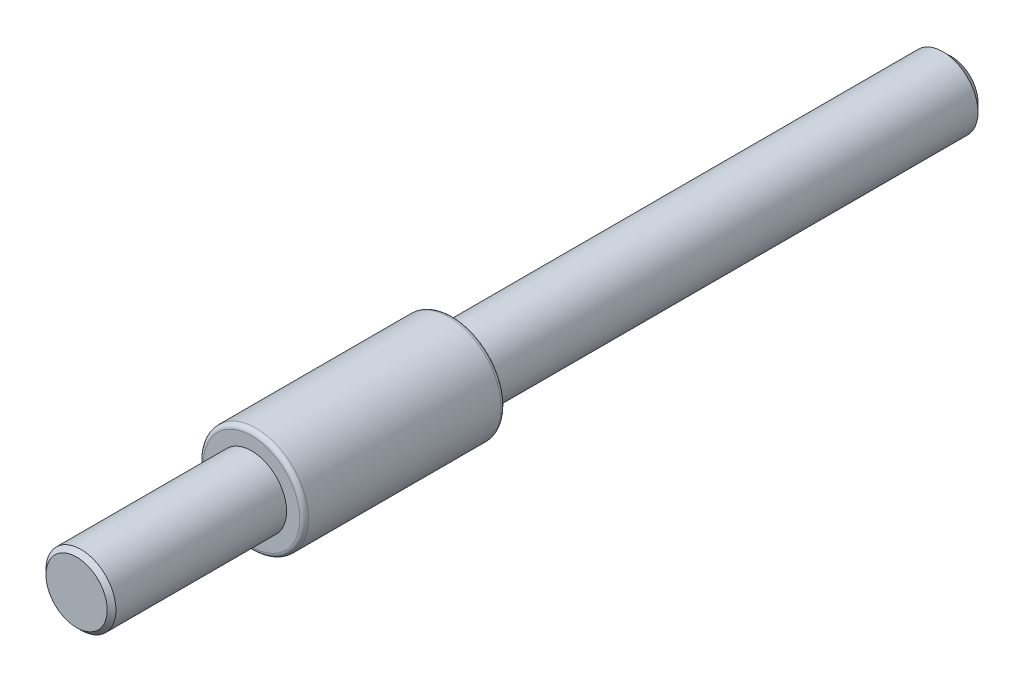
ISO-10303-21;
HEADER;
FILE_DESCRIPTION(('STEP AP214'),'2;1');
FILE_NAME('part.step','',(''),(''),'','','');
FILE_SCHEMA(('AUTOMOTIVE_DESIGN { 1 0 10303 214 1 1 1 1 }'));
ENDSEC;
DATA;
#1=APPLICATION_CONTEXT('core data for automotive mechanical design processes');
#2=APPLICATION_PROTOCOL_DEFINITION('international standard','automotive_design',2000,#1);
#3=PRODUCT_CONTEXT('',#1,'mechanical');
#4=PRODUCT('Part','Part','',(#3));
#5=PRODUCT_RELATED_PRODUCT_CATEGORY('part','',(#4));
#6=PRODUCT_DEFINITION_FORMATION('','',#4);
#7=PRODUCT_DEFINITION_CONTEXT('part definition',#1,'design');
#8=PRODUCT_DEFINITION('design','',#6,#7);
#9=PRODUCT_DEFINITION_SHAPE('','',#8);
#10=(LENGTH_UNIT() NAMED_UNIT(*) SI_UNIT(.MILLI.,.METRE.));
#11=(NAMED_UNIT(*) PLANE_ANGLE_UNIT() SI_UNIT($,.RADIAN.));
#12=(NAMED_UNIT(*) SI_UNIT($,.STERADIAN.) SOLID_ANGLE_UNIT());
#13=UNCERTAINTY_MEASURE_WITH_UNIT(LENGTH_MEASURE(1.E-05),#10,'distance_accuracy_value','');
#14=(GEOMETRIC_REPRESENTATION_CONTEXT(3) GLOBAL_UNCERTAINTY_ASSIGNED_CONTEXT((#13)) GLOBAL_UNIT_ASSIGNED_CONTEXT((#10,
#11,#12)) REPRESENTATION_CONTEXT('',''));
#15=CARTESIAN_POINT('',(0.,0.,0.));
#16=DIRECTION('',(0.,0.,1.));
#17=DIRECTION('',(1.,0.,0.));
#18=AXIS2_PLACEMENT_3D('',#15,#16,#17);
#19=CARTESIAN_POINT('',(0.,0.,-23.));
#20=DIRECTION('',(0.,0.,1.));
#21=DIRECTION('',(1.,0.,0.));
#22=AXIS2_PLACEMENT_3D('',#19,#20,#21);
#23=PLANE('',#22);
#24=CARTESIAN_POINT('',(0.,0.,-23.));
#25=DIRECTION('',(0.,0.,1.));
#26=DIRECTION('',(1.,0.,0.));
#27=AXIS2_PLACEMENT_3D('',#24,#25,#26);
#28=CIRCLE('',#27,5.5);
#29=CARTESIAN_POINT('',(5.5,0.,-23.));
#30=VERTEX_POINT('',#29);
#31=EDGE_CURVE('E43',#30,#30,#28,.F.);
#32=ORIENTED_EDGE('',*,*,#31,.T.);
#33=EDGE_LOOP('',(#32));
#34=FACE_BOUND('',#33,.T.);
#35=CARTESIAN_POINT('',(0.,0.,-23.));
#36=DIRECTION('',(0.,0.,1.));
#37=DIRECTION('',(1.,0.,0.));
#38=AXIS2_PLACEMENT_3D('',#35,#36,#37);
#39=CIRCLE('',#38,4.);
#40=CARTESIAN_POINT('',(4.,0.,-23.));
#41=VERTEX_POINT('',#40);
#42=EDGE_CURVE('E64',#41,#41,#39,.F.);
#43=ORIENTED_EDGE('',*,*,#42,.F.);
#44=EDGE_LOOP('',(#43));
#45=FACE_BOUND('',#44,.T.);
#46=ADVANCED_FACE('F32',(#34,#45),#23,.F.);
#47=CARTESIAN_POINT('',(0.,0.,20.));
#48=DIRECTION('',(0.,0.,-1.));
#49=DIRECTION('',(-1.,0.,0.));
#50=AXIS2_PLACEMENT_3D('',#47,#48,#49);
#51=CYLINDRICAL_SURFACE('',#50,4.);
#52=CARTESIAN_POINT('',(0.,0.,19.5));
#53=DIRECTION('',(0.,0.,1.));
#54=DIRECTION('',(1.,0.,0.));
#55=AXIS2_PLACEMENT_3D('',#52,#53,#54);
#56=CIRCLE('',#55,4.);
#57=CARTESIAN_POINT('',(4.,0.,19.5));
#58=VERTEX_POINT('',#57);
#59=EDGE_CURVE('E52',#58,#58,#56,.F.);
#60=ORIENTED_EDGE('',*,*,#59,.T.);
#61=EDGE_LOOP('',(#60));
#62=FACE_BOUND('',#61,.T.);
#63=CARTESIAN_POINT('',(0.,0.,0.));
#64=DIRECTION('',(0.,0.,1.));
#65=DIRECTION('',(1.,0.,0.));
#66=AXIS2_PLACEMENT_3D('',#63,#64,#65);
#67=CIRCLE('',#66,4.);
#68=CARTESIAN_POINT('',(4.,0.,0.));
#69=VERTEX_POINT('',#68);
#70=EDGE_CURVE('E67',#69,#69,#67,.T.);
#71=ORIENTED_EDGE('',*,*,#70,.T.);
#72=EDGE_LOOP('',(#71));
#73=FACE_BOUND('',#72,.T.);
#74=ADVANCED_FACE('F71',(#62,#73),#51,.T.);
#75=CARTESIAN_POINT('',(0.,0.,20.));
#76=DIRECTION('',(0.,0.,1.));
#77=DIRECTION('',(1.,0.,0.));
#78=AXIS2_PLACEMENT_3D('',#75,#76,#77);
#79=PLANE('',#78);
#80=CARTESIAN_POINT('',(0.,0.,20.));
#81=DIRECTION('',(0.,0.,1.));
#82=DIRECTION('',(1.,0.,0.));
#83=AXIS2_PLACEMENT_3D('',#80,#81,#82);
#84=CIRCLE('',#83,3.5);
#85=CARTESIAN_POINT('',(3.5,0.,20.));
#86=VERTEX_POINT('',#85);
#87=EDGE_CURVE('E55',#86,#86,#84,.T.);
#88=ORIENTED_EDGE('',*,*,#87,.T.);
#89=EDGE_LOOP('',(#88));
#90=FACE_BOUND('',#89,.T.);
#91=ADVANCED_FACE('F76',(#90),#79,.T.);
#92=CARTESIAN_POINT('',(0.,0.,0.));
#93=DIRECTION('',(0.,0.,1.));
#94=DIRECTION('',(1.,0.,0.));
#95=AXIS2_PLACEMENT_3D('',#92,#93,#94);
#96=PLANE('',#95);
#97=CARTESIAN_POINT('',(0.,0.,0.));
#98=DIRECTION('',(0.,0.,1.));
#99=DIRECTION('',(1.,0.,0.));
#100=AXIS2_PLACEMENT_3D('',#97,#98,#99);
#101=CIRCLE('',#100,5.5);
#102=CARTESIAN_POINT('',(5.5,0.,0.));
#103=VERTEX_POINT('',#102);
#104=EDGE_CURVE('E39',#103,#103,#101,.T.);
#105=ORIENTED_EDGE('',*,*,#104,.T.);
#106=EDGE_LOOP('',(#105));
#107=FACE_BOUND('',#106,.T.);
#108=ORIENTED_EDGE('',*,*,#70,.F.);
#109=EDGE_LOOP('',(#108));
#110=FACE_BOUND('',#109,.T.);
#111=ADVANCED_FACE('F73',(#107,#110),#96,.T.);
#112=CARTESIAN_POINT('',(0.,0.,-23.));
#113=DIRECTION('',(0.,0.,1.));
#114=DIRECTION('',(1.,0.,0.));
#115=AXIS2_PLACEMENT_3D('',#112,#113,#114);
#116=CYLINDRICAL_SURFACE('',#115,6.);
#117=CARTESIAN_POINT('',(0.,0.,-0.5));
#118=DIRECTION('',(0.,0.,1.));
#119=DIRECTION('',(1.,0.,0.));
#120=AXIS2_PLACEMENT_3D('',#117,#118,#119);
#121=CIRCLE('',#120,6.);
#122=CARTESIAN_POINT('',(6.,0.,-0.5));
#123=VERTEX_POINT('',#122);
#124=EDGE_CURVE('E10',#123,#123,#121,.F.);
#125=ORIENTED_EDGE('',*,*,#124,.T.);
#126=EDGE_LOOP('',(#125));
#127=FACE_BOUND('',#126,.T.);
#128=CARTESIAN_POINT('',(0.,0.,-22.5));
#129=DIRECTION('',(0.,0.,1.));
#130=DIRECTION('',(1.,0.,0.));
#131=AXIS2_PLACEMENT_3D('',#128,#129,#130);
#132=CIRCLE('',#131,6.);
#133=CARTESIAN_POINT('',(6.,0.,-22.5));
#134=VERTEX_POINT('',#133);
#135=EDGE_CURVE('E47',#134,#134,#132,.T.);
#136=ORIENTED_EDGE('',*,*,#135,.T.);
#137=EDGE_LOOP('',(#136));
#138=FACE_BOUND('',#137,.T.);
#139=ADVANCED_FACE('F75',(#127,#138),#116,.T.);
#140=CARTESIAN_POINT('',(0.,0.,-80.));
#141=DIRECTION('',(0.,0.,1.));
#142=DIRECTION('',(1.,0.,0.));
#143=AXIS2_PLACEMENT_3D('',#140,#141,#142);
#144=CYLINDRICAL_SURFACE('',#143,4.);
#145=CARTESIAN_POINT('',(0.,0.,-79.));
#146=DIRECTION('',(0.,0.,-1.));
#147=DIRECTION('',(-1.,0.,0.));
#148=AXIS2_PLACEMENT_3D('',#145,#146,#147);
#149=CIRCLE('',#148,4.);
#150=CARTESIAN_POINT('',(4.,0.,-79.));
#151=VERTEX_POINT('',#150);
#152=EDGE_CURVE('E58',#151,#151,#149,.F.);
#153=CARTESIAN_POINT('',(4.,0.,-79.));
#154=CARTESIAN_POINT('',(4.,0.,-78.4166666666667));
#155=CARTESIAN_POINT('',(4.,0.,-77.8333333333333));
#156=CARTESIAN_POINT('',(4.,0.,-76.6666666666667));
#157=CARTESIAN_POINT('',(4.,0.,-76.0833333333334));
#158=CARTESIAN_POINT('',(4.,0.,-74.9166666666667));
#159=CARTESIAN_POINT('',(4.,0.,-74.3333333333333));
#160=CARTESIAN_POINT('',(4.,0.,-73.1666666666667));
#161=CARTESIAN_POINT('',(4.,0.,-72.5833333333333));
#162=CARTESIAN_POINT('',(4.,0.,-71.4166666666667));
#163=CARTESIAN_POINT('',(4.,0.,-70.8333333333333));
#164=CARTESIAN_POINT('',(4.,0.,-69.6666666666667));
#165=CARTESIAN_POINT('',(4.,0.,-69.0833333333333));
#166=CARTESIAN_POINT('',(4.,0.,-67.9166666666667));
#167=CARTESIAN_POINT('',(4.,0.,-67.3333333333333));
#168=CARTESIAN_POINT('',(4.,0.,-66.1666666666667));
#169=CARTESIAN_POINT('',(4.,0.,-65.5833333333333));
#170=CARTESIAN_POINT('',(4.,0.,-64.4166666666667));
#171=CARTESIAN_POINT('',(4.,0.,-63.8333333333333));
#172=CARTESIAN_POINT('',(4.,0.,-62.6666666666667));
#173=CARTESIAN_POINT('',(4.,0.,-62.0833333333333));
#174=CARTESIAN_POINT('',(4.,0.,-60.9166666666667));
#175=CARTESIAN_POINT('',(4.,0.,-60.3333333333333));
#176=CARTESIAN_POINT('',(4.,0.,-59.1666666666667));
#177=CARTESIAN_POINT('',(4.,0.,-58.5833333333333));
#178=CARTESIAN_POINT('',(4.,0.,-57.4166666666667));
#179=CARTESIAN_POINT('',(4.,0.,-56.8333333333333));
#180=CARTESIAN_POINT('',(4.,0.,-55.6666666666667));
#181=CARTESIAN_POINT('',(4.,0.,-55.0833333333333));
#182=CARTESIAN_POINT('',(4.,0.,-53.9166666666667));
#183=CARTESIAN_POINT('',(4.,0.,-53.3333333333333));
#184=CARTESIAN_POINT('',(4.,0.,-52.1666666666667));
#185=CARTESIAN_POINT('',(4.,0.,-51.5833333333333));
#186=CARTESIAN_POINT('',(4.,0.,-50.4166666666667));
#187=CARTESIAN_POINT('',(4.,0.,-49.8333333333333));
#188=CARTESIAN_POINT('',(4.,0.,-48.6666666666667));
#189=CARTESIAN_POINT('',(4.,0.,-48.0833333333333));
#190=CARTESIAN_POINT('',(4.,0.,-46.9166666666667));
#191=CARTESIAN_POINT('',(4.,0.,-46.3333333333333));
#192=CARTESIAN_POINT('',(4.,0.,-45.1666666666667));
#193=CARTESIAN_POINT('',(4.,0.,-44.5833333333333));
#194=CARTESIAN_POINT('',(4.,0.,-43.4166666666667));
#195=CARTESIAN_POINT('',(4.,0.,-42.8333333333333));
#196=CARTESIAN_POINT('',(4.,0.,-41.6666666666667));
#197=CARTESIAN_POINT('',(4.,0.,-41.0833333333333));
#198=CARTESIAN_POINT('',(4.,0.,-39.9166666666667));
#199=CARTESIAN_POINT('',(4.,0.,-39.3333333333333));
#200=CARTESIAN_POINT('',(4.,0.,-38.1666666666667));
#201=CARTESIAN_POINT('',(4.,0.,-37.5833333333333));
#202=CARTESIAN_POINT('',(4.,0.,-36.4166666666667));
#203=CARTESIAN_POINT('',(4.,0.,-35.8333333333333));
#204=CARTESIAN_POINT('',(4.,0.,-34.6666666666667));
#205=CARTESIAN_POINT('',(4.,0.,-34.0833333333333));
#206=CARTESIAN_POINT('',(4.,0.,-32.9166666666667));
#207=CARTESIAN_POINT('',(4.,0.,-32.3333333333333));
#208=CARTESIAN_POINT('',(4.,0.,-31.1666666666667));
#209=CARTESIAN_POINT('',(4.,0.,-30.5833333333333));
#210=CARTESIAN_POINT('',(4.,0.,-29.4166666666667));
#211=CARTESIAN_POINT('',(4.,0.,-28.8333333333333));
#212=CARTESIAN_POINT('',(4.,0.,-27.6666666666667));
#213=CARTESIAN_POINT('',(4.,0.,-27.0833333333333));
#214=CARTESIAN_POINT('',(4.,0.,-25.9166666666667));
#215=CARTESIAN_POINT('',(4.,0.,-25.3333333333333));
#216=CARTESIAN_POINT('',(4.,0.,-24.1666666666667));
#217=CARTESIAN_POINT('',(4.,0.,-23.5833333333333));
#218=CARTESIAN_POINT('',(4.,0.,-23.));
#219=B_SPLINE_CURVE_WITH_KNOTS('',3,(#153,#154,#155,#156,#157,#158,#159,#160,#161,#162,#163,
#164,#165,#166,#167,#168,#169,#170,#171,#172,#173,#174,#175,#176,#177,#178,#179,#180,#181,#182,
#183,#184,#185,#186,#187,#188,#189,#190,#191,#192,#193,#194,#195,#196,#197,#198,#199,#200,#201,
#202,#203,#204,#205,#206,#207,#208,#209,#210,#211,#212,#213,#214,#215,#216,#217,#218),
.UNSPECIFIED.,.F.,.F.,(4,2,2,2,2,2,2,2,2,2,2,2,2,2,2,2,2,2,2,2,2,2,2,2,2,2,2,2,2,2,2,2,4),(0.,
1.74999999999999,3.49999999999999,5.24999999999999,6.99999999999999,8.74999999999999,10.5,12.25,
14.,15.75,17.5,19.25,21.,22.75,24.5,26.25,28.,29.75,31.5,33.25,35.,36.75,38.5,40.25,42.,43.75,
45.5,47.25,49.,50.75,52.5,54.25,56.),.UNSPECIFIED.);
#220=EDGE_CURVE('BSEAM82',#151,#41,#219,.T.);
#221=ORIENTED_EDGE('',*,*,#152,.T.);
#222=ORIENTED_EDGE('',*,*,#42,.T.);
#223=ORIENTED_EDGE('',*,*,#220,.T.);
#224=ORIENTED_EDGE('',*,*,#220,.F.);
#225=EDGE_LOOP('',(#221,#223,#222,#224));
#226=FACE_BOUND('',#225,.T.);
#227=ADVANCED_FACE('F82',(#226),#144,.T.);
#228=CARTESIAN_POINT('',(0.,0.,-80.));
#229=DIRECTION('',(0.,0.,-1.));
#230=DIRECTION('',(-1.,0.,0.));
#231=AXIS2_PLACEMENT_3D('',#228,#229,#230);
#232=PLANE('',#231);
#233=CARTESIAN_POINT('',(0.,0.,-80.));
#234=DIRECTION('',(0.,0.,-1.));
#235=DIRECTION('',(-1.,0.,0.));
#236=AXIS2_PLACEMENT_3D('',#233,#234,#235);
#237=CIRCLE('',#236,3.00000000000002);
#238=CARTESIAN_POINT('',(-3.00000000000002,0.,-80.));
#239=VERTEX_POINT('',#238);
#240=EDGE_CURVE('E61',#239,#239,#237,.T.);
#241=ORIENTED_EDGE('',*,*,#240,.T.);
#242=EDGE_LOOP('',(#241));
#243=FACE_BOUND('',#242,.T.);
#244=ADVANCED_FACE('F98',(#243),#232,.T.);
#245=CARTESIAN_POINT('',(0.,0.,-80.));
#246=DIRECTION('',(0.,0.,1.));
#247=DIRECTION('',(1.,0.,0.));
#248=AXIS2_PLACEMENT_3D('',#245,#246,#247);
#249=CONICAL_SURFACE('',#248,3.00000000000002,0.785398163397447);
#250=ORIENTED_EDGE('',*,*,#152,.F.);
#251=EDGE_LOOP('',(#250));
#252=FACE_BOUND('',#251,.T.);
#253=ORIENTED_EDGE('',*,*,#240,.F.);
#254=EDGE_LOOP('',(#253));
#255=FACE_BOUND('',#254,.T.);
#256=ADVANCED_FACE('F101',(#252,#255),#249,.T.);
#257=CARTESIAN_POINT('',(0.,0.,20.));
#258=DIRECTION('',(0.,0.,-1.));
#259=DIRECTION('',(-1.,0.,0.));
#260=AXIS2_PLACEMENT_3D('',#257,#258,#259);
#261=CONICAL_SURFACE('',#260,3.5,0.785398163397448);
#262=ORIENTED_EDGE('',*,*,#59,.F.);
#263=EDGE_LOOP('',(#262));
#264=FACE_BOUND('',#263,.T.);
#265=ORIENTED_EDGE('',*,*,#87,.F.);
#266=EDGE_LOOP('',(#265));
#267=FACE_BOUND('',#266,.T.);
#268=ADVANCED_FACE('F106',(#264,#267),#261,.T.);
#269=CARTESIAN_POINT('',(0.,0.,-22.5));
#270=DIRECTION('',(0.,0.,1.));
#271=DIRECTION('',(1.,0.,0.));
#272=AXIS2_PLACEMENT_3D('',#269,#270,#271);
#273=TOROIDAL_SURFACE('',#272,5.5,0.5);
#274=ORIENTED_EDGE('',*,*,#31,.F.);
#275=EDGE_LOOP('',(#274));
#276=FACE_BOUND('',#275,.T.);
#277=ORIENTED_EDGE('',*,*,#135,.F.);
#278=EDGE_LOOP('',(#277));
#279=FACE_BOUND('',#278,.T.);
#280=ADVANCED_FACE('F114',(#276,#279),#273,.T.);
#281=CARTESIAN_POINT('',(0.,0.,-0.5));
#282=DIRECTION('',(0.,0.,1.));
#283=DIRECTION('',(1.,0.,0.));
#284=AXIS2_PLACEMENT_3D('',#281,#282,#283);
#285=TOROIDAL_SURFACE('',#284,5.5,0.5);
#286=ORIENTED_EDGE('',*,*,#124,.F.);
#287=EDGE_LOOP('',(#286));
#288=FACE_BOUND('',#287,.T.);
#289=ORIENTED_EDGE('',*,*,#104,.F.);
#290=EDGE_LOOP('',(#289));
#291=FACE_BOUND('',#290,.T.);
#292=ADVANCED_FACE('F34',(#288,#291),#285,.T.);
#293=CLOSED_SHELL('',(#46,#74,#91,#111,#139,#227,#244,#256,#268,#280,#292));
#294=MANIFOLD_SOLID_BREP('B2',#293);
#295=ADVANCED_BREP_SHAPE_REPRESENTATION('',(#18,#294),#14);
#296=SHAPE_DEFINITION_REPRESENTATION(#9,#295);
ENDSEC;
END-ISO-10303-21;
